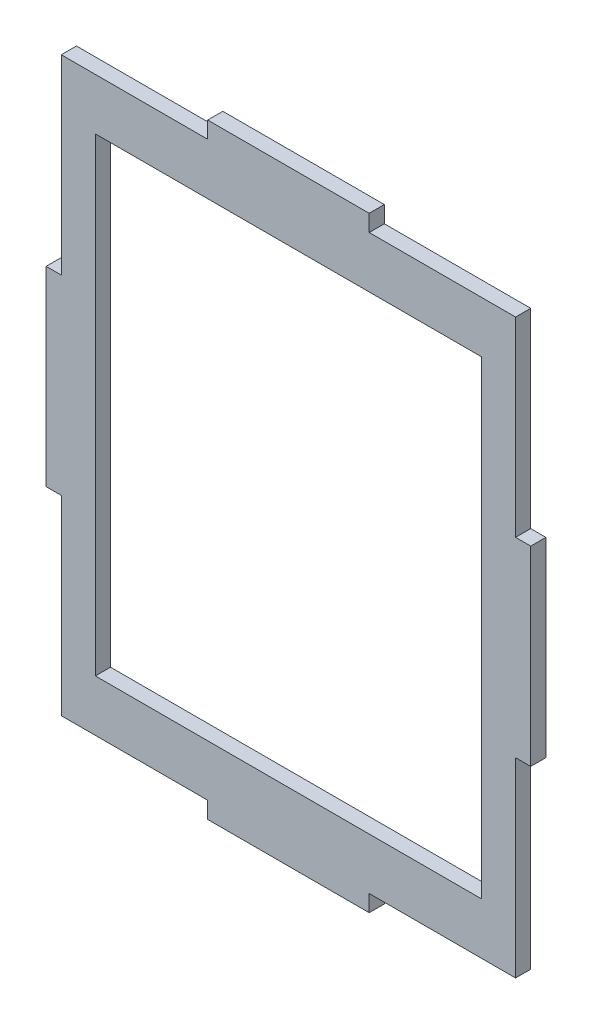
ISO-10303-21;
HEADER;
FILE_DESCRIPTION(('STEP AP214'),'2;1');
FILE_NAME('part.step','',(''),(''),'','','');
FILE_SCHEMA(('AUTOMOTIVE_DESIGN { 1 0 10303 214 1 1 1 1 }'));
ENDSEC;
DATA;
#1=APPLICATION_CONTEXT('core data for automotive mechanical design processes');
#2=APPLICATION_PROTOCOL_DEFINITION('international standard','automotive_design',2000,#1);
#3=PRODUCT_CONTEXT('',#1,'mechanical');
#4=PRODUCT('Part','Part','',(#3));
#5=PRODUCT_RELATED_PRODUCT_CATEGORY('part','',(#4));
#6=PRODUCT_DEFINITION_FORMATION('','',#4);
#7=PRODUCT_DEFINITION_CONTEXT('part definition',#1,'design');
#8=PRODUCT_DEFINITION('design','',#6,#7);
#9=PRODUCT_DEFINITION_SHAPE('','',#8);
#10=(LENGTH_UNIT() NAMED_UNIT(*) SI_UNIT(.MILLI.,.METRE.));
#11=(NAMED_UNIT(*) PLANE_ANGLE_UNIT() SI_UNIT($,.RADIAN.));
#12=(NAMED_UNIT(*) SI_UNIT($,.STERADIAN.) SOLID_ANGLE_UNIT());
#13=UNCERTAINTY_MEASURE_WITH_UNIT(LENGTH_MEASURE(1.E-05),#10,'distance_accuracy_value','');
#14=(GEOMETRIC_REPRESENTATION_CONTEXT(3) GLOBAL_UNCERTAINTY_ASSIGNED_CONTEXT((#13)) GLOBAL_UNIT_ASSIGNED_CONTEXT((#10,
#11,#12)) REPRESENTATION_CONTEXT('',''));
#15=CARTESIAN_POINT('',(0.,0.,0.));
#16=DIRECTION('',(0.,0.,1.));
#17=DIRECTION('',(1.,0.,0.));
#18=AXIS2_PLACEMENT_3D('',#15,#16,#17);
#19=CARTESIAN_POINT('',(0.,0.,2.54));
#20=DIRECTION('',(0.,0.,-1.));
#21=DIRECTION('',(-1.,0.,0.));
#22=AXIS2_PLACEMENT_3D('',#19,#20,#21);
#23=PLANE('',#22);
#24=DIRECTION('',(1.,0.,0.));
#25=VECTOR('',#24,1.);
#26=CARTESIAN_POINT('',(32.385,-39.37,2.54));
#27=LINE('',#26,#25);
#28=CARTESIAN_POINT('',(-32.385,-39.37,2.54));
#29=VERTEX_POINT('',#28);
#30=CARTESIAN_POINT('',(32.385,-39.37,2.54));
#31=VERTEX_POINT('',#30);
#32=EDGE_CURVE('E223',#29,#31,#27,.T.);
#33=ORIENTED_EDGE('',*,*,#32,.F.);
#34=DIRECTION('',(0.,-1.,0.));
#35=VECTOR('',#34,1.);
#36=CARTESIAN_POINT('',(-32.385,39.37,2.54));
#37=LINE('',#36,#35);
#38=CARTESIAN_POINT('',(-32.385,39.37,2.54));
#39=VERTEX_POINT('',#38);
#40=EDGE_CURVE('E50',#39,#29,#37,.T.);
#41=ORIENTED_EDGE('',*,*,#40,.F.);
#42=DIRECTION('',(-1.,0.,0.));
#43=VECTOR('',#42,1.);
#44=CARTESIAN_POINT('',(32.385,39.37,2.54));
#45=LINE('',#44,#43);
#46=CARTESIAN_POINT('',(32.385,39.37,2.54));
#47=VERTEX_POINT('',#46);
#48=EDGE_CURVE('E214',#47,#39,#45,.T.);
#49=ORIENTED_EDGE('',*,*,#48,.F.);
#50=DIRECTION('',(0.,1.,0.));
#51=VECTOR('',#50,1.);
#52=CARTESIAN_POINT('',(32.385,39.37,2.54));
#53=LINE('',#52,#51);
#54=EDGE_CURVE('E217',#31,#47,#53,.T.);
#55=ORIENTED_EDGE('',*,*,#54,.F.);
#56=EDGE_LOOP('',(#33,#41,#49,#55));
#57=FACE_BOUND('',#56,.T.);
#58=DIRECTION('',(1.,0.,0.));
#59=VECTOR('',#58,1.);
#60=CARTESIAN_POINT('',(0.,-16.002,2.54));
#61=LINE('',#60,#59);
#62=CARTESIAN_POINT('',(38.1,-16.002,2.54));
#63=VERTEX_POINT('',#62);
#64=CARTESIAN_POINT('',(40.64,-16.002,2.54));
#65=VERTEX_POINT('',#64);
#66=EDGE_CURVE('E229',#63,#65,#61,.T.);
#67=ORIENTED_EDGE('',*,*,#66,.T.);
#68=DIRECTION('',(0.,1.,0.));
#69=VECTOR('',#68,1.);
#70=CARTESIAN_POINT('',(40.64,50.8,2.54));
#71=LINE('',#70,#69);
#72=CARTESIAN_POINT('',(40.64,16.002,2.54));
#73=VERTEX_POINT('',#72);
#74=EDGE_CURVE('E42',#65,#73,#71,.T.);
#75=ORIENTED_EDGE('',*,*,#74,.T.);
#76=DIRECTION('',(1.,0.,0.));
#77=VECTOR('',#76,1.);
#78=CARTESIAN_POINT('',(0.,16.002,2.54));
#79=LINE('',#78,#77);
#80=CARTESIAN_POINT('',(38.1,16.002,2.54));
#81=VERTEX_POINT('',#80);
#82=EDGE_CURVE('E253',#81,#73,#79,.T.);
#83=ORIENTED_EDGE('',*,*,#82,.F.);
#84=DIRECTION('',(0.,1.,0.));
#85=VECTOR('',#84,1.);
#86=CARTESIAN_POINT('',(38.1,0.,2.54));
#87=LINE('',#86,#85);
#88=CARTESIAN_POINT('',(38.1,48.006,2.54));
#89=VERTEX_POINT('',#88);
#90=EDGE_CURVE('E245',#81,#89,#87,.T.);
#91=ORIENTED_EDGE('',*,*,#90,.T.);
#92=DIRECTION('',(1.,0.,0.));
#93=VECTOR('',#92,1.);
#94=CARTESIAN_POINT('',(0.,48.006,2.54));
#95=LINE('',#94,#93);
#96=CARTESIAN_POINT('',(13.5466666666667,48.006,2.54));
#97=VERTEX_POINT('',#96);
#98=EDGE_CURVE('E320',#97,#89,#95,.T.);
#99=ORIENTED_EDGE('',*,*,#98,.F.);
#100=DIRECTION('',(0.,-1.,0.));
#101=VECTOR('',#100,1.);
#102=CARTESIAN_POINT('',(13.5466666666666,0.,2.54));
#103=LINE('',#102,#101);
#104=CARTESIAN_POINT('',(13.5466666666667,50.8,2.54));
#105=VERTEX_POINT('',#104);
#106=EDGE_CURVE('E318',#105,#97,#103,.T.);
#107=ORIENTED_EDGE('',*,*,#106,.F.);
#108=DIRECTION('',(-1.,0.,0.));
#109=VECTOR('',#108,1.);
#110=CARTESIAN_POINT('',(40.64,50.8,2.54));
#111=LINE('',#110,#109);
#112=CARTESIAN_POINT('',(-13.5466666666667,50.8,2.54));
#113=VERTEX_POINT('',#112);
#114=EDGE_CURVE('E11',#105,#113,#111,.T.);
#115=ORIENTED_EDGE('',*,*,#114,.T.);
#116=DIRECTION('',(0.,-1.,0.));
#117=VECTOR('',#116,1.);
#118=CARTESIAN_POINT('',(-13.5466666666666,0.,2.54));
#119=LINE('',#118,#117);
#120=CARTESIAN_POINT('',(-13.5466666666667,48.006,2.54));
#121=VERTEX_POINT('',#120);
#122=EDGE_CURVE('E305',#113,#121,#119,.T.);
#123=ORIENTED_EDGE('',*,*,#122,.T.);
#124=DIRECTION('',(1.,0.,0.));
#125=VECTOR('',#124,1.);
#126=CARTESIAN_POINT('',(0.,48.006,2.54));
#127=LINE('',#126,#125);
#128=CARTESIAN_POINT('',(-38.1,48.006,2.54));
#129=VERTEX_POINT('',#128);
#130=EDGE_CURVE('E303',#129,#121,#127,.T.);
#131=ORIENTED_EDGE('',*,*,#130,.F.);
#132=DIRECTION('',(0.,1.,0.));
#133=VECTOR('',#132,1.);
#134=CARTESIAN_POINT('',(-38.1,0.,2.54));
#135=LINE('',#134,#133);
#136=CARTESIAN_POINT('',(-38.1,16.002,2.54));
#137=VERTEX_POINT('',#136);
#138=EDGE_CURVE('E271',#137,#129,#135,.T.);
#139=ORIENTED_EDGE('',*,*,#138,.F.);
#140=DIRECTION('',(-1.,0.,0.));
#141=VECTOR('',#140,1.);
#142=CARTESIAN_POINT('',(0.,16.002,2.54));
#143=LINE('',#142,#141);
#144=CARTESIAN_POINT('',(-40.64,16.002,2.54));
#145=VERTEX_POINT('',#144);
#146=EDGE_CURVE('E263',#137,#145,#143,.T.);
#147=ORIENTED_EDGE('',*,*,#146,.T.);
#148=DIRECTION('',(0.,-1.,0.));
#149=VECTOR('',#148,1.);
#150=CARTESIAN_POINT('',(-40.64,50.8,2.54));
#151=LINE('',#150,#149);
#152=CARTESIAN_POINT('',(-40.64,-16.002,2.54));
#153=VERTEX_POINT('',#152);
#154=EDGE_CURVE('E367',#145,#153,#151,.T.);
#155=ORIENTED_EDGE('',*,*,#154,.T.);
#156=DIRECTION('',(-1.,0.,0.));
#157=VECTOR('',#156,1.);
#158=CARTESIAN_POINT('',(0.,-16.002,2.54));
#159=LINE('',#158,#157);
#160=CARTESIAN_POINT('',(-38.1,-16.002,2.54));
#161=VERTEX_POINT('',#160);
#162=EDGE_CURVE('E288',#161,#153,#159,.T.);
#163=ORIENTED_EDGE('',*,*,#162,.F.);
#164=DIRECTION('',(0.,-1.,0.));
#165=VECTOR('',#164,1.);
#166=CARTESIAN_POINT('',(-38.1,0.,2.54));
#167=LINE('',#166,#165);
#168=CARTESIAN_POINT('',(-38.1,-48.006,2.54));
#169=VERTEX_POINT('',#168);
#170=EDGE_CURVE('E280',#161,#169,#167,.T.);
#171=ORIENTED_EDGE('',*,*,#170,.T.);
#172=DIRECTION('',(1.,0.,0.));
#173=VECTOR('',#172,1.);
#174=CARTESIAN_POINT('',(0.,-48.006,2.54));
#175=LINE('',#174,#173);
#176=CARTESIAN_POINT('',(-13.5466666666667,-48.006,2.54));
#177=VERTEX_POINT('',#176);
#178=EDGE_CURVE('E354',#169,#177,#175,.T.);
#179=ORIENTED_EDGE('',*,*,#178,.T.);
#180=DIRECTION('',(0.,1.,0.));
#181=VECTOR('',#180,1.);
#182=CARTESIAN_POINT('',(-13.5466666666666,0.,2.54));
#183=LINE('',#182,#181);
#184=CARTESIAN_POINT('',(-13.5466666666667,-50.8,2.54));
#185=VERTEX_POINT('',#184);
#186=EDGE_CURVE('E351',#185,#177,#183,.T.);
#187=ORIENTED_EDGE('',*,*,#186,.F.);
#188=DIRECTION('',(1.,0.,0.));
#189=VECTOR('',#188,1.);
#190=CARTESIAN_POINT('',(40.64,-50.8,2.54));
#191=LINE('',#190,#189);
#192=CARTESIAN_POINT('',(13.5466666666667,-50.8,2.54));
#193=VERTEX_POINT('',#192);
#194=EDGE_CURVE('E369',#185,#193,#191,.T.);
#195=ORIENTED_EDGE('',*,*,#194,.T.);
#196=DIRECTION('',(0.,1.,0.));
#197=VECTOR('',#196,1.);
#198=CARTESIAN_POINT('',(13.5466666666666,0.,2.54));
#199=LINE('',#198,#197);
#200=CARTESIAN_POINT('',(13.5466666666667,-48.006,2.54));
#201=VERTEX_POINT('',#200);
#202=EDGE_CURVE('E335',#193,#201,#199,.T.);
#203=ORIENTED_EDGE('',*,*,#202,.T.);
#204=DIRECTION('',(1.,0.,0.));
#205=VECTOR('',#204,1.);
#206=CARTESIAN_POINT('',(0.,-48.006,2.54));
#207=LINE('',#206,#205);
#208=CARTESIAN_POINT('',(38.1,-48.006,2.54));
#209=VERTEX_POINT('',#208);
#210=EDGE_CURVE('E338',#201,#209,#207,.T.);
#211=ORIENTED_EDGE('',*,*,#210,.T.);
#212=DIRECTION('',(0.,-1.,0.));
#213=VECTOR('',#212,1.);
#214=CARTESIAN_POINT('',(38.1,0.,2.54));
#215=LINE('',#214,#213);
#216=EDGE_CURVE('E236',#63,#209,#215,.T.);
#217=ORIENTED_EDGE('',*,*,#216,.F.);
#218=EDGE_LOOP('',(#67,#75,#83,#91,#99,#107,#115,#123,#131,#139,#147,#155,#163,#171,#179,#187,
#195,#203,#211,#217));
#219=FACE_BOUND('',#218,.T.);
#220=ADVANCED_FACE('F33',(#57,#219),#23,.F.);
#221=CARTESIAN_POINT('',(0.,0.,0.));
#222=DIRECTION('',(0.,0.,-1.));
#223=DIRECTION('',(-1.,0.,0.));
#224=AXIS2_PLACEMENT_3D('',#221,#222,#223);
#225=PLANE('',#224);
#226=DIRECTION('',(0.,-1.,0.));
#227=VECTOR('',#226,1.);
#228=CARTESIAN_POINT('',(-32.385,39.37,0.));
#229=LINE('',#228,#227);
#230=CARTESIAN_POINT('',(-32.385,39.37,0.));
#231=VERTEX_POINT('',#230);
#232=CARTESIAN_POINT('',(-32.385,-39.37,0.));
#233=VERTEX_POINT('',#232);
#234=EDGE_CURVE('E198',#231,#233,#229,.T.);
#235=ORIENTED_EDGE('',*,*,#234,.T.);
#236=DIRECTION('',(1.,0.,0.));
#237=VECTOR('',#236,1.);
#238=CARTESIAN_POINT('',(32.385,-39.37,0.));
#239=LINE('',#238,#237);
#240=CARTESIAN_POINT('',(32.385,-39.37,0.));
#241=VERTEX_POINT('',#240);
#242=EDGE_CURVE('E207',#233,#241,#239,.T.);
#243=ORIENTED_EDGE('',*,*,#242,.T.);
#244=DIRECTION('',(0.,1.,0.));
#245=VECTOR('',#244,1.);
#246=CARTESIAN_POINT('',(32.385,39.37,0.));
#247=LINE('',#246,#245);
#248=CARTESIAN_POINT('',(32.385,39.37,0.));
#249=VERTEX_POINT('',#248);
#250=EDGE_CURVE('E58',#241,#249,#247,.T.);
#251=ORIENTED_EDGE('',*,*,#250,.T.);
#252=DIRECTION('',(-1.,0.,0.));
#253=VECTOR('',#252,1.);
#254=CARTESIAN_POINT('',(32.385,39.37,0.));
#255=LINE('',#254,#253);
#256=EDGE_CURVE('E204',#249,#231,#255,.T.);
#257=ORIENTED_EDGE('',*,*,#256,.T.);
#258=EDGE_LOOP('',(#235,#243,#251,#257));
#259=FACE_BOUND('',#258,.T.);
#260=DIRECTION('',(0.,1.,0.));
#261=VECTOR('',#260,1.);
#262=CARTESIAN_POINT('',(40.64,50.8,0.));
#263=LINE('',#262,#261);
#264=CARTESIAN_POINT('',(40.64,-16.002,0.));
#265=VERTEX_POINT('',#264);
#266=CARTESIAN_POINT('',(40.64,16.002,0.));
#267=VERTEX_POINT('',#266);
#268=EDGE_CURVE('E376',#265,#267,#263,.T.);
#269=ORIENTED_EDGE('',*,*,#268,.F.);
#270=DIRECTION('',(1.,0.,0.));
#271=VECTOR('',#270,1.);
#272=CARTESIAN_POINT('',(0.,-16.002,0.));
#273=LINE('',#272,#271);
#274=CARTESIAN_POINT('',(38.1,-16.002,0.));
#275=VERTEX_POINT('',#274);
#276=EDGE_CURVE('E233',#275,#265,#273,.T.);
#277=ORIENTED_EDGE('',*,*,#276,.F.);
#278=DIRECTION('',(0.,-1.,0.));
#279=VECTOR('',#278,1.);
#280=CARTESIAN_POINT('',(38.1,0.,0.));
#281=LINE('',#280,#279);
#282=CARTESIAN_POINT('',(38.1,-48.006,0.));
#283=VERTEX_POINT('',#282);
#284=EDGE_CURVE('E235',#275,#283,#281,.T.);
#285=ORIENTED_EDGE('',*,*,#284,.T.);
#286=DIRECTION('',(1.,0.,0.));
#287=VECTOR('',#286,1.);
#288=CARTESIAN_POINT('',(0.,-48.006,0.));
#289=LINE('',#288,#287);
#290=CARTESIAN_POINT('',(13.5466666666667,-48.006,0.));
#291=VERTEX_POINT('',#290);
#292=EDGE_CURVE('E339',#291,#283,#289,.T.);
#293=ORIENTED_EDGE('',*,*,#292,.F.);
#294=DIRECTION('',(0.,1.,0.));
#295=VECTOR('',#294,1.);
#296=CARTESIAN_POINT('',(13.5466666666666,0.,0.));
#297=LINE('',#296,#295);
#298=CARTESIAN_POINT('',(13.5466666666667,-50.8,0.));
#299=VERTEX_POINT('',#298);
#300=EDGE_CURVE('E332',#299,#291,#297,.T.);
#301=ORIENTED_EDGE('',*,*,#300,.F.);
#302=DIRECTION('',(1.,0.,0.));
#303=VECTOR('',#302,1.);
#304=CARTESIAN_POINT('',(40.64,-50.8,0.));
#305=LINE('',#304,#303);
#306=CARTESIAN_POINT('',(-13.5466666666667,-50.8,0.));
#307=VERTEX_POINT('',#306);
#308=EDGE_CURVE('E374',#307,#299,#305,.T.);
#309=ORIENTED_EDGE('',*,*,#308,.F.);
#310=DIRECTION('',(0.,1.,0.));
#311=VECTOR('',#310,1.);
#312=CARTESIAN_POINT('',(-13.5466666666666,0.,0.));
#313=LINE('',#312,#311);
#314=CARTESIAN_POINT('',(-13.5466666666667,-48.006,0.));
#315=VERTEX_POINT('',#314);
#316=EDGE_CURVE('E349',#307,#315,#313,.T.);
#317=ORIENTED_EDGE('',*,*,#316,.T.);
#318=DIRECTION('',(1.,0.,0.));
#319=VECTOR('',#318,1.);
#320=CARTESIAN_POINT('',(0.,-48.006,0.));
#321=LINE('',#320,#319);
#322=CARTESIAN_POINT('',(-38.1,-48.006,0.));
#323=VERTEX_POINT('',#322);
#324=EDGE_CURVE('E355',#323,#315,#321,.T.);
#325=ORIENTED_EDGE('',*,*,#324,.F.);
#326=DIRECTION('',(0.,-1.,0.));
#327=VECTOR('',#326,1.);
#328=CARTESIAN_POINT('',(-38.1,0.,0.));
#329=LINE('',#328,#327);
#330=CARTESIAN_POINT('',(-38.1,-16.002,0.));
#331=VERTEX_POINT('',#330);
#332=EDGE_CURVE('E285',#331,#323,#329,.T.);
#333=ORIENTED_EDGE('',*,*,#332,.F.);
#334=DIRECTION('',(-1.,0.,0.));
#335=VECTOR('',#334,1.);
#336=CARTESIAN_POINT('',(0.,-16.002,0.));
#337=LINE('',#336,#335);
#338=CARTESIAN_POINT('',(-40.64,-16.002,0.));
#339=VERTEX_POINT('',#338);
#340=EDGE_CURVE('E287',#331,#339,#337,.T.);
#341=ORIENTED_EDGE('',*,*,#340,.T.);
#342=DIRECTION('',(0.,-1.,0.));
#343=VECTOR('',#342,1.);
#344=CARTESIAN_POINT('',(-40.64,50.8,0.));
#345=LINE('',#344,#343);
#346=CARTESIAN_POINT('',(-40.64,16.002,0.));
#347=VERTEX_POINT('',#346);
#348=EDGE_CURVE('E364',#347,#339,#345,.T.);
#349=ORIENTED_EDGE('',*,*,#348,.F.);
#350=DIRECTION('',(-1.,0.,0.));
#351=VECTOR('',#350,1.);
#352=CARTESIAN_POINT('',(0.,16.002,0.));
#353=LINE('',#352,#351);
#354=CARTESIAN_POINT('',(-38.1,16.002,0.));
#355=VERTEX_POINT('',#354);
#356=EDGE_CURVE('E268',#355,#347,#353,.T.);
#357=ORIENTED_EDGE('',*,*,#356,.F.);
#358=DIRECTION('',(0.,1.,0.));
#359=VECTOR('',#358,1.);
#360=CARTESIAN_POINT('',(-38.1,0.,0.));
#361=LINE('',#360,#359);
#362=CARTESIAN_POINT('',(-38.1,48.006,0.));
#363=VERTEX_POINT('',#362);
#364=EDGE_CURVE('E270',#355,#363,#361,.T.);
#365=ORIENTED_EDGE('',*,*,#364,.T.);
#366=DIRECTION('',(1.,0.,0.));
#367=VECTOR('',#366,1.);
#368=CARTESIAN_POINT('',(0.,48.006,0.));
#369=LINE('',#368,#367);
#370=CARTESIAN_POINT('',(-13.5466666666667,48.006,0.));
#371=VERTEX_POINT('',#370);
#372=EDGE_CURVE('E298',#363,#371,#369,.T.);
#373=ORIENTED_EDGE('',*,*,#372,.T.);
#374=DIRECTION('',(0.,-1.,0.));
#375=VECTOR('',#374,1.);
#376=CARTESIAN_POINT('',(-13.5466666666666,0.,0.));
#377=LINE('',#376,#375);
#378=CARTESIAN_POINT('',(-13.5466666666667,50.8,0.));
#379=VERTEX_POINT('',#378);
#380=EDGE_CURVE('E306',#379,#371,#377,.T.);
#381=ORIENTED_EDGE('',*,*,#380,.F.);
#382=DIRECTION('',(-1.,0.,0.));
#383=VECTOR('',#382,1.);
#384=CARTESIAN_POINT('',(40.64,50.8,0.));
#385=LINE('',#384,#383);
#386=CARTESIAN_POINT('',(13.5466666666667,50.8,0.));
#387=VERTEX_POINT('',#386);
#388=EDGE_CURVE('E37',#387,#379,#385,.T.);
#389=ORIENTED_EDGE('',*,*,#388,.F.);
#390=DIRECTION('',(0.,-1.,0.));
#391=VECTOR('',#390,1.);
#392=CARTESIAN_POINT('',(13.5466666666666,0.,0.));
#393=LINE('',#392,#391);
#394=CARTESIAN_POINT('',(13.5466666666667,48.006,0.));
#395=VERTEX_POINT('',#394);
#396=EDGE_CURVE('E316',#387,#395,#393,.T.);
#397=ORIENTED_EDGE('',*,*,#396,.T.);
#398=DIRECTION('',(1.,0.,0.));
#399=VECTOR('',#398,1.);
#400=CARTESIAN_POINT('',(0.,48.006,0.));
#401=LINE('',#400,#399);
#402=CARTESIAN_POINT('',(38.1,48.006,0.));
#403=VERTEX_POINT('',#402);
#404=EDGE_CURVE('E321',#395,#403,#401,.T.);
#405=ORIENTED_EDGE('',*,*,#404,.T.);
#406=DIRECTION('',(0.,1.,0.));
#407=VECTOR('',#406,1.);
#408=CARTESIAN_POINT('',(38.1,0.,0.));
#409=LINE('',#408,#407);
#410=CARTESIAN_POINT('',(38.1,16.002,0.));
#411=VERTEX_POINT('',#410);
#412=EDGE_CURVE('E250',#411,#403,#409,.T.);
#413=ORIENTED_EDGE('',*,*,#412,.F.);
#414=DIRECTION('',(1.,0.,0.));
#415=VECTOR('',#414,1.);
#416=CARTESIAN_POINT('',(0.,16.002,0.));
#417=LINE('',#416,#415);
#418=EDGE_CURVE('E252',#411,#267,#417,.T.);
#419=ORIENTED_EDGE('',*,*,#418,.T.);
#420=EDGE_LOOP('',(#269,#277,#285,#293,#301,#309,#317,#325,#333,#341,#349,#357,#365,#373,#381,
#389,#397,#405,#413,#419));
#421=FACE_BOUND('',#420,.T.);
#422=ADVANCED_FACE('F211',(#259,#421),#225,.T.);
#423=CARTESIAN_POINT('',(40.64,50.8,2.54));
#424=DIRECTION('',(-1.,0.,0.));
#425=DIRECTION('',(0.,-1.,0.));
#426=AXIS2_PLACEMENT_3D('',#423,#424,#425);
#427=PLANE('',#426);
#428=DIRECTION('',(0.,0.,1.));
#429=VECTOR('',#428,1.);
#430=CARTESIAN_POINT('',(40.64,-16.002,0.));
#431=LINE('',#430,#429);
#432=EDGE_CURVE('E243',#265,#65,#431,.T.);
#433=ORIENTED_EDGE('',*,*,#432,.F.);
#434=ORIENTED_EDGE('',*,*,#268,.T.);
#435=DIRECTION('',(0.,0.,1.));
#436=VECTOR('',#435,1.);
#437=CARTESIAN_POINT('',(40.64,16.002,0.));
#438=LINE('',#437,#436);
#439=EDGE_CURVE('E264',#267,#73,#438,.T.);
#440=ORIENTED_EDGE('',*,*,#439,.T.);
#441=ORIENTED_EDGE('',*,*,#74,.F.);
#442=EDGE_LOOP('',(#433,#434,#440,#441));
#443=FACE_BOUND('',#442,.T.);
#444=ADVANCED_FACE('F412',(#443),#427,.F.);
#445=CARTESIAN_POINT('',(0.,48.006,2.54));
#446=DIRECTION('',(0.,1.,0.));
#447=DIRECTION('',(0.,0.,1.));
#448=AXIS2_PLACEMENT_3D('',#445,#446,#447);
#449=PLANE('',#448);
#450=ORIENTED_EDGE('',*,*,#98,.T.);
#451=DIRECTION('',(0.,0.,1.));
#452=VECTOR('',#451,1.);
#453=CARTESIAN_POINT('',(38.1,48.006,0.));
#454=LINE('',#453,#452);
#455=EDGE_CURVE('E261',#403,#89,#454,.T.);
#456=ORIENTED_EDGE('',*,*,#455,.F.);
#457=ORIENTED_EDGE('',*,*,#404,.F.);
#458=DIRECTION('',(0.,0.,-1.));
#459=VECTOR('',#458,1.);
#460=CARTESIAN_POINT('',(13.5466666666667,48.006,2.54));
#461=LINE('',#460,#459);
#462=EDGE_CURVE('E329',#97,#395,#461,.T.);
#463=ORIENTED_EDGE('',*,*,#462,.F.);
#464=EDGE_LOOP('',(#450,#456,#457,#463));
#465=FACE_BOUND('',#464,.T.);
#466=ADVANCED_FACE('F401',(#465),#449,.T.);
#467=CARTESIAN_POINT('',(-40.64,50.8,2.54));
#468=DIRECTION('',(1.,0.,0.));
#469=DIRECTION('',(0.,1.,0.));
#470=AXIS2_PLACEMENT_3D('',#467,#468,#469);
#471=PLANE('',#470);
#472=DIRECTION('',(0.,0.,1.));
#473=VECTOR('',#472,1.);
#474=CARTESIAN_POINT('',(-40.64,16.002,0.));
#475=LINE('',#474,#473);
#476=EDGE_CURVE('E278',#347,#145,#475,.T.);
#477=ORIENTED_EDGE('',*,*,#476,.F.);
#478=ORIENTED_EDGE('',*,*,#348,.T.);
#479=DIRECTION('',(0.,0.,1.));
#480=VECTOR('',#479,1.);
#481=CARTESIAN_POINT('',(-40.64,-16.002,0.));
#482=LINE('',#481,#480);
#483=EDGE_CURVE('E299',#339,#153,#482,.T.);
#484=ORIENTED_EDGE('',*,*,#483,.T.);
#485=ORIENTED_EDGE('',*,*,#154,.F.);
#486=EDGE_LOOP('',(#477,#478,#484,#485));
#487=FACE_BOUND('',#486,.T.);
#488=ADVANCED_FACE('F35',(#487),#471,.F.);
#489=CARTESIAN_POINT('',(0.,-48.006,2.54));
#490=DIRECTION('',(0.,1.,0.));
#491=DIRECTION('',(0.,0.,1.));
#492=AXIS2_PLACEMENT_3D('',#489,#490,#491);
#493=PLANE('',#492);
#494=DIRECTION('',(0.,0.,1.));
#495=VECTOR('',#494,1.);
#496=CARTESIAN_POINT('',(-38.1,-48.006,0.));
#497=LINE('',#496,#495);
#498=EDGE_CURVE('E296',#323,#169,#497,.T.);
#499=ORIENTED_EDGE('',*,*,#498,.F.);
#500=ORIENTED_EDGE('',*,*,#324,.T.);
#501=DIRECTION('',(0.,0.,-1.));
#502=VECTOR('',#501,1.);
#503=CARTESIAN_POINT('',(-13.5466666666667,-48.006,2.54));
#504=LINE('',#503,#502);
#505=EDGE_CURVE('E361',#177,#315,#504,.T.);
#506=ORIENTED_EDGE('',*,*,#505,.F.);
#507=ORIENTED_EDGE('',*,*,#178,.F.);
#508=EDGE_LOOP('',(#499,#500,#506,#507));
#509=FACE_BOUND('',#508,.T.);
#510=ADVANCED_FACE('F441',(#509),#493,.F.);
#511=CARTESIAN_POINT('',(40.64,50.8,2.54));
#512=DIRECTION('',(0.,-1.,0.));
#513=DIRECTION('',(1.,0.,0.));
#514=AXIS2_PLACEMENT_3D('',#511,#512,#513);
#515=PLANE('',#514);
#516=ORIENTED_EDGE('',*,*,#388,.T.);
#517=DIRECTION('',(0.,0.,-1.));
#518=VECTOR('',#517,1.);
#519=CARTESIAN_POINT('',(-13.5466666666667,50.8,2.54));
#520=LINE('',#519,#518);
#521=EDGE_CURVE('E309',#113,#379,#520,.T.);
#522=ORIENTED_EDGE('',*,*,#521,.F.);
#523=ORIENTED_EDGE('',*,*,#114,.F.);
#524=DIRECTION('',(0.,0.,-1.));
#525=VECTOR('',#524,1.);
#526=CARTESIAN_POINT('',(13.5466666666667,50.8,2.54));
#527=LINE('',#526,#525);
#528=EDGE_CURVE('E324',#105,#387,#527,.T.);
#529=ORIENTED_EDGE('',*,*,#528,.T.);
#530=EDGE_LOOP('',(#516,#522,#523,#529));
#531=FACE_BOUND('',#530,.T.);
#532=ADVANCED_FACE('F385',(#531),#515,.F.);
#533=CARTESIAN_POINT('',(40.64,-50.8,2.54));
#534=DIRECTION('',(0.,1.,0.));
#535=DIRECTION('',(-1.,0.,0.));
#536=AXIS2_PLACEMENT_3D('',#533,#534,#535);
#537=PLANE('',#536);
#538=ORIENTED_EDGE('',*,*,#308,.T.);
#539=DIRECTION('',(0.,0.,-1.));
#540=VECTOR('',#539,1.);
#541=CARTESIAN_POINT('',(13.5466666666667,-50.8,2.54));
#542=LINE('',#541,#540);
#543=EDGE_CURVE('E347',#193,#299,#542,.T.);
#544=ORIENTED_EDGE('',*,*,#543,.F.);
#545=ORIENTED_EDGE('',*,*,#194,.F.);
#546=DIRECTION('',(0.,0.,-1.));
#547=VECTOR('',#546,1.);
#548=CARTESIAN_POINT('',(-13.5466666666667,-50.8,2.54));
#549=LINE('',#548,#547);
#550=EDGE_CURVE('E357',#185,#307,#549,.T.);
#551=ORIENTED_EDGE('',*,*,#550,.T.);
#552=EDGE_LOOP('',(#538,#544,#545,#551));
#553=FACE_BOUND('',#552,.T.);
#554=ADVANCED_FACE('F430',(#553),#537,.F.);
#555=CARTESIAN_POINT('',(-13.5466666666666,0.,2.54));
#556=DIRECTION('',(-1.,0.,0.));
#557=DIRECTION('',(0.,-1.,0.));
#558=AXIS2_PLACEMENT_3D('',#555,#556,#557);
#559=PLANE('',#558);
#560=ORIENTED_EDGE('',*,*,#316,.F.);
#561=ORIENTED_EDGE('',*,*,#550,.F.);
#562=ORIENTED_EDGE('',*,*,#186,.T.);
#563=ORIENTED_EDGE('',*,*,#505,.T.);
#564=EDGE_LOOP('',(#560,#561,#562,#563));
#565=FACE_BOUND('',#564,.T.);
#566=ADVANCED_FACE('F434',(#565),#559,.T.);
#567=CARTESIAN_POINT('',(13.5466666666666,0.,2.54));
#568=DIRECTION('',(-1.,0.,0.));
#569=DIRECTION('',(0.,-1.,0.));
#570=AXIS2_PLACEMENT_3D('',#567,#568,#569);
#571=PLANE('',#570);
#572=ORIENTED_EDGE('',*,*,#300,.T.);
#573=DIRECTION('',(0.,0.,-1.));
#574=VECTOR('',#573,1.);
#575=CARTESIAN_POINT('',(13.5466666666667,-48.006,2.54));
#576=LINE('',#575,#574);
#577=EDGE_CURVE('E342',#201,#291,#576,.T.);
#578=ORIENTED_EDGE('',*,*,#577,.F.);
#579=ORIENTED_EDGE('',*,*,#202,.F.);
#580=ORIENTED_EDGE('',*,*,#543,.T.);
#581=EDGE_LOOP('',(#572,#578,#579,#580));
#582=FACE_BOUND('',#581,.T.);
#583=ADVANCED_FACE('F426',(#582),#571,.F.);
#584=CARTESIAN_POINT('',(0.,-48.006,2.54));
#585=DIRECTION('',(0.,1.,0.));
#586=DIRECTION('',(0.,0.,1.));
#587=AXIS2_PLACEMENT_3D('',#584,#585,#586);
#588=PLANE('',#587);
#589=ORIENTED_EDGE('',*,*,#292,.T.);
#590=DIRECTION('',(0.,0.,1.));
#591=VECTOR('',#590,1.);
#592=CARTESIAN_POINT('',(38.1,-48.006,0.));
#593=LINE('',#592,#591);
#594=EDGE_CURVE('E246',#283,#209,#593,.T.);
#595=ORIENTED_EDGE('',*,*,#594,.T.);
#596=ORIENTED_EDGE('',*,*,#210,.F.);
#597=ORIENTED_EDGE('',*,*,#577,.T.);
#598=EDGE_LOOP('',(#589,#595,#596,#597));
#599=FACE_BOUND('',#598,.T.);
#600=ADVANCED_FACE('F423',(#599),#588,.F.);
#601=CARTESIAN_POINT('',(13.5466666666666,0.,2.54));
#602=DIRECTION('',(1.,0.,0.));
#603=DIRECTION('',(0.,1.,0.));
#604=AXIS2_PLACEMENT_3D('',#601,#602,#603);
#605=PLANE('',#604);
#606=ORIENTED_EDGE('',*,*,#396,.F.);
#607=ORIENTED_EDGE('',*,*,#528,.F.);
#608=ORIENTED_EDGE('',*,*,#106,.T.);
#609=ORIENTED_EDGE('',*,*,#462,.T.);
#610=EDGE_LOOP('',(#606,#607,#608,#609));
#611=FACE_BOUND('',#610,.T.);
#612=ADVANCED_FACE('F399',(#611),#605,.T.);
#613=CARTESIAN_POINT('',(0.,48.006,2.54));
#614=DIRECTION('',(0.,1.,0.));
#615=DIRECTION('',(0.,0.,1.));
#616=AXIS2_PLACEMENT_3D('',#613,#614,#615);
#617=PLANE('',#616);
#618=DIRECTION('',(0.,0.,1.));
#619=VECTOR('',#618,1.);
#620=CARTESIAN_POINT('',(-38.1,48.006,0.));
#621=LINE('',#620,#619);
#622=EDGE_CURVE('E281',#363,#129,#621,.T.);
#623=ORIENTED_EDGE('',*,*,#622,.T.);
#624=ORIENTED_EDGE('',*,*,#130,.T.);
#625=DIRECTION('',(0.,0.,-1.));
#626=VECTOR('',#625,1.);
#627=CARTESIAN_POINT('',(-13.5466666666667,48.006,2.54));
#628=LINE('',#627,#626);
#629=EDGE_CURVE('E313',#121,#371,#628,.T.);
#630=ORIENTED_EDGE('',*,*,#629,.T.);
#631=ORIENTED_EDGE('',*,*,#372,.F.);
#632=EDGE_LOOP('',(#623,#624,#630,#631));
#633=FACE_BOUND('',#632,.T.);
#634=ADVANCED_FACE('F462',(#633),#617,.T.);
#635=CARTESIAN_POINT('',(-13.5466666666666,0.,2.54));
#636=DIRECTION('',(1.,0.,0.));
#637=DIRECTION('',(0.,1.,0.));
#638=AXIS2_PLACEMENT_3D('',#635,#636,#637);
#639=PLANE('',#638);
#640=ORIENTED_EDGE('',*,*,#380,.T.);
#641=ORIENTED_EDGE('',*,*,#629,.F.);
#642=ORIENTED_EDGE('',*,*,#122,.F.);
#643=ORIENTED_EDGE('',*,*,#521,.T.);
#644=EDGE_LOOP('',(#640,#641,#642,#643));
#645=FACE_BOUND('',#644,.T.);
#646=ADVANCED_FACE('F391',(#645),#639,.F.);
#647=CARTESIAN_POINT('',(-38.1,0.,0.));
#648=DIRECTION('',(-1.,0.,0.));
#649=DIRECTION('',(0.,-1.,0.));
#650=AXIS2_PLACEMENT_3D('',#647,#648,#649);
#651=PLANE('',#650);
#652=ORIENTED_EDGE('',*,*,#170,.F.);
#653=DIRECTION('',(0.,0.,1.));
#654=VECTOR('',#653,1.);
#655=CARTESIAN_POINT('',(-38.1,-16.002,0.));
#656=LINE('',#655,#654);
#657=EDGE_CURVE('E291',#331,#161,#656,.T.);
#658=ORIENTED_EDGE('',*,*,#657,.F.);
#659=ORIENTED_EDGE('',*,*,#332,.T.);
#660=ORIENTED_EDGE('',*,*,#498,.T.);
#661=EDGE_LOOP('',(#652,#658,#659,#660));
#662=FACE_BOUND('',#661,.T.);
#663=ADVANCED_FACE('F447',(#662),#651,.T.);
#664=CARTESIAN_POINT('',(0.,-16.002,0.));
#665=DIRECTION('',(0.,1.,0.));
#666=DIRECTION('',(0.,0.,1.));
#667=AXIS2_PLACEMENT_3D('',#664,#665,#666);
#668=PLANE('',#667);
#669=ORIENTED_EDGE('',*,*,#162,.T.);
#670=ORIENTED_EDGE('',*,*,#483,.F.);
#671=ORIENTED_EDGE('',*,*,#340,.F.);
#672=ORIENTED_EDGE('',*,*,#657,.T.);
#673=EDGE_LOOP('',(#669,#670,#671,#672));
#674=FACE_BOUND('',#673,.T.);
#675=ADVANCED_FACE('F450',(#674),#668,.F.);
#676=CARTESIAN_POINT('',(0.,16.002,0.));
#677=DIRECTION('',(0.,1.,0.));
#678=DIRECTION('',(0.,0.,1.));
#679=AXIS2_PLACEMENT_3D('',#676,#677,#678);
#680=PLANE('',#679);
#681=ORIENTED_EDGE('',*,*,#146,.F.);
#682=DIRECTION('',(0.,0.,1.));
#683=VECTOR('',#682,1.);
#684=CARTESIAN_POINT('',(-38.1,16.002,0.));
#685=LINE('',#684,#683);
#686=EDGE_CURVE('E274',#355,#137,#685,.T.);
#687=ORIENTED_EDGE('',*,*,#686,.F.);
#688=ORIENTED_EDGE('',*,*,#356,.T.);
#689=ORIENTED_EDGE('',*,*,#476,.T.);
#690=EDGE_LOOP('',(#681,#687,#688,#689));
#691=FACE_BOUND('',#690,.T.);
#692=ADVANCED_FACE('F458',(#691),#680,.T.);
#693=CARTESIAN_POINT('',(-38.1,0.,0.));
#694=DIRECTION('',(1.,0.,0.));
#695=DIRECTION('',(0.,1.,0.));
#696=AXIS2_PLACEMENT_3D('',#693,#694,#695);
#697=PLANE('',#696);
#698=ORIENTED_EDGE('',*,*,#138,.T.);
#699=ORIENTED_EDGE('',*,*,#622,.F.);
#700=ORIENTED_EDGE('',*,*,#364,.F.);
#701=ORIENTED_EDGE('',*,*,#686,.T.);
#702=EDGE_LOOP('',(#698,#699,#700,#701));
#703=FACE_BOUND('',#702,.T.);
#704=ADVANCED_FACE('F460',(#703),#697,.F.);
#705=CARTESIAN_POINT('',(38.1,0.,0.));
#706=DIRECTION('',(1.,0.,0.));
#707=DIRECTION('',(0.,1.,0.));
#708=AXIS2_PLACEMENT_3D('',#705,#706,#707);
#709=PLANE('',#708);
#710=ORIENTED_EDGE('',*,*,#90,.F.);
#711=DIRECTION('',(0.,0.,1.));
#712=VECTOR('',#711,1.);
#713=CARTESIAN_POINT('',(38.1,16.002,0.));
#714=LINE('',#713,#712);
#715=EDGE_CURVE('E256',#411,#81,#714,.T.);
#716=ORIENTED_EDGE('',*,*,#715,.F.);
#717=ORIENTED_EDGE('',*,*,#412,.T.);
#718=ORIENTED_EDGE('',*,*,#455,.T.);
#719=EDGE_LOOP('',(#710,#716,#717,#718));
#720=FACE_BOUND('',#719,.T.);
#721=ADVANCED_FACE('F407',(#720),#709,.T.);
#722=CARTESIAN_POINT('',(0.,16.002,0.));
#723=DIRECTION('',(0.,-1.,0.));
#724=DIRECTION('',(0.,0.,-1.));
#725=AXIS2_PLACEMENT_3D('',#722,#723,#724);
#726=PLANE('',#725);
#727=ORIENTED_EDGE('',*,*,#82,.T.);
#728=ORIENTED_EDGE('',*,*,#439,.F.);
#729=ORIENTED_EDGE('',*,*,#418,.F.);
#730=ORIENTED_EDGE('',*,*,#715,.T.);
#731=EDGE_LOOP('',(#727,#728,#729,#730));
#732=FACE_BOUND('',#731,.T.);
#733=ADVANCED_FACE('F410',(#732),#726,.F.);
#734=CARTESIAN_POINT('',(0.,-16.002,0.));
#735=DIRECTION('',(0.,-1.,0.));
#736=DIRECTION('',(0.,0.,-1.));
#737=AXIS2_PLACEMENT_3D('',#734,#735,#736);
#738=PLANE('',#737);
#739=ORIENTED_EDGE('',*,*,#66,.F.);
#740=DIRECTION('',(0.,0.,1.));
#741=VECTOR('',#740,1.);
#742=CARTESIAN_POINT('',(38.1,-16.002,0.));
#743=LINE('',#742,#741);
#744=EDGE_CURVE('E239',#275,#63,#743,.T.);
#745=ORIENTED_EDGE('',*,*,#744,.F.);
#746=ORIENTED_EDGE('',*,*,#276,.T.);
#747=ORIENTED_EDGE('',*,*,#432,.T.);
#748=EDGE_LOOP('',(#739,#745,#746,#747));
#749=FACE_BOUND('',#748,.T.);
#750=ADVANCED_FACE('F416',(#749),#738,.T.);
#751=CARTESIAN_POINT('',(38.1,0.,0.));
#752=DIRECTION('',(-1.,0.,0.));
#753=DIRECTION('',(0.,-1.,0.));
#754=AXIS2_PLACEMENT_3D('',#751,#752,#753);
#755=PLANE('',#754);
#756=ORIENTED_EDGE('',*,*,#216,.T.);
#757=ORIENTED_EDGE('',*,*,#594,.F.);
#758=ORIENTED_EDGE('',*,*,#284,.F.);
#759=ORIENTED_EDGE('',*,*,#744,.T.);
#760=EDGE_LOOP('',(#756,#757,#758,#759));
#761=FACE_BOUND('',#760,.T.);
#762=ADVANCED_FACE('F528',(#761),#755,.F.);
#763=CARTESIAN_POINT('',(-32.385,39.37,0.));
#764=DIRECTION('',(-1.,0.,0.));
#765=DIRECTION('',(0.,-1.,0.));
#766=AXIS2_PLACEMENT_3D('',#763,#764,#765);
#767=PLANE('',#766);
#768=ORIENTED_EDGE('',*,*,#40,.T.);
#769=DIRECTION('',(0.,0.,1.));
#770=VECTOR('',#769,1.);
#771=CARTESIAN_POINT('',(-32.385,-39.37,0.));
#772=LINE('',#771,#770);
#773=EDGE_CURVE('E194',#233,#29,#772,.T.);
#774=ORIENTED_EDGE('',*,*,#773,.F.);
#775=ORIENTED_EDGE('',*,*,#234,.F.);
#776=DIRECTION('',(0.,0.,1.));
#777=VECTOR('',#776,1.);
#778=CARTESIAN_POINT('',(-32.385,39.37,0.));
#779=LINE('',#778,#777);
#780=EDGE_CURVE('E227',#231,#39,#779,.T.);
#781=ORIENTED_EDGE('',*,*,#780,.T.);
#782=EDGE_LOOP('',(#768,#774,#775,#781));
#783=FACE_BOUND('',#782,.T.);
#784=ADVANCED_FACE('F196',(#783),#767,.F.);
#785=CARTESIAN_POINT('',(32.385,39.37,0.));
#786=DIRECTION('',(0.,1.,0.));
#787=DIRECTION('',(-1.,0.,0.));
#788=AXIS2_PLACEMENT_3D('',#785,#786,#787);
#789=PLANE('',#788);
#790=ORIENTED_EDGE('',*,*,#48,.T.);
#791=ORIENTED_EDGE('',*,*,#780,.F.);
#792=ORIENTED_EDGE('',*,*,#256,.F.);
#793=DIRECTION('',(0.,0.,1.));
#794=VECTOR('',#793,1.);
#795=CARTESIAN_POINT('',(32.385,39.37,0.));
#796=LINE('',#795,#794);
#797=EDGE_CURVE('E230',#249,#47,#796,.T.);
#798=ORIENTED_EDGE('',*,*,#797,.T.);
#799=EDGE_LOOP('',(#790,#791,#792,#798));
#800=FACE_BOUND('',#799,.T.);
#801=ADVANCED_FACE('F527',(#800),#789,.F.);
#802=CARTESIAN_POINT('',(32.385,39.37,0.));
#803=DIRECTION('',(1.,0.,0.));
#804=DIRECTION('',(0.,1.,0.));
#805=AXIS2_PLACEMENT_3D('',#802,#803,#804);
#806=PLANE('',#805);
#807=ORIENTED_EDGE('',*,*,#54,.T.);
#808=ORIENTED_EDGE('',*,*,#797,.F.);
#809=ORIENTED_EDGE('',*,*,#250,.F.);
#810=DIRECTION('',(0.,0.,1.));
#811=VECTOR('',#810,1.);
#812=CARTESIAN_POINT('',(32.385,-39.37,0.));
#813=LINE('',#812,#811);
#814=EDGE_CURVE('E203',#241,#31,#813,.T.);
#815=ORIENTED_EDGE('',*,*,#814,.T.);
#816=EDGE_LOOP('',(#807,#808,#809,#815));
#817=FACE_BOUND('',#816,.T.);
#818=ADVANCED_FACE('F539',(#817),#806,.F.);
#819=CARTESIAN_POINT('',(32.385,-39.37,0.));
#820=DIRECTION('',(0.,-1.,0.));
#821=DIRECTION('',(1.,0.,0.));
#822=AXIS2_PLACEMENT_3D('',#819,#820,#821);
#823=PLANE('',#822);
#824=ORIENTED_EDGE('',*,*,#32,.T.);
#825=ORIENTED_EDGE('',*,*,#814,.F.);
#826=ORIENTED_EDGE('',*,*,#242,.F.);
#827=ORIENTED_EDGE('',*,*,#773,.T.);
#828=EDGE_LOOP('',(#824,#825,#826,#827));
#829=FACE_BOUND('',#828,.T.);
#830=ADVANCED_FACE('F208',(#829),#823,.F.);
#831=CLOSED_SHELL('',(#220,#422,#444,#466,#488,#510,#532,#554,#566,#583,#600,#612,#634,#646,
#663,#675,#692,#704,#721,#733,#750,#762,#784,#801,#818,#830));
#832=MANIFOLD_SOLID_BREP('B2',#831);
#833=ADVANCED_BREP_SHAPE_REPRESENTATION('',(#18,#832),#14);
#834=SHAPE_DEFINITION_REPRESENTATION(#9,#833);
ENDSEC;
END-ISO-10303-21;
